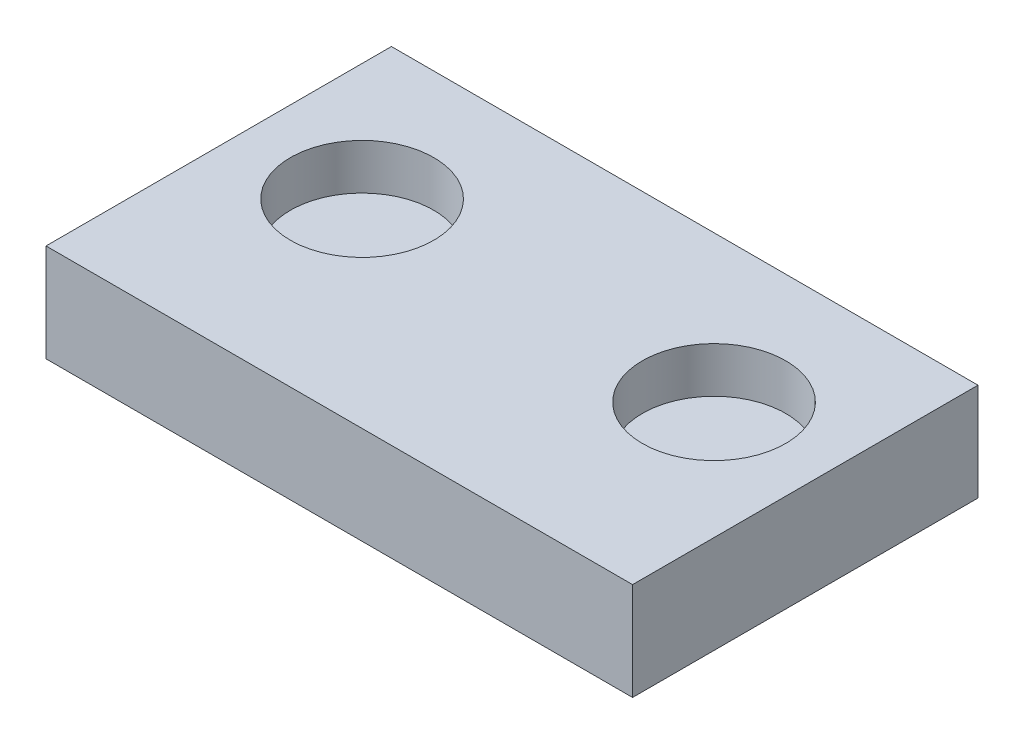
ISO-10303-21;
HEADER;
FILE_DESCRIPTION(('STEP AP214'),'2;1');
FILE_NAME('part.step','',(''),(''),'','','');
FILE_SCHEMA(('AUTOMOTIVE_DESIGN { 1 0 10303 214 1 1 1 1 }'));
ENDSEC;
DATA;
#1=APPLICATION_CONTEXT('core data for automotive mechanical design processes');
#2=APPLICATION_PROTOCOL_DEFINITION('international standard','automotive_design',2000,#1);
#3=PRODUCT_CONTEXT('',#1,'mechanical');
#4=PRODUCT('Part','Part','',(#3));
#5=PRODUCT_RELATED_PRODUCT_CATEGORY('part','',(#4));
#6=PRODUCT_DEFINITION_FORMATION('','',#4);
#7=PRODUCT_DEFINITION_CONTEXT('part definition',#1,'design');
#8=PRODUCT_DEFINITION('design','',#6,#7);
#9=PRODUCT_DEFINITION_SHAPE('','',#8);
#10=(LENGTH_UNIT() NAMED_UNIT(*) SI_UNIT(.MILLI.,.METRE.));
#11=(NAMED_UNIT(*) PLANE_ANGLE_UNIT() SI_UNIT($,.RADIAN.));
#12=(NAMED_UNIT(*) SI_UNIT($,.STERADIAN.) SOLID_ANGLE_UNIT());
#13=UNCERTAINTY_MEASURE_WITH_UNIT(LENGTH_MEASURE(1.E-05),#10,'distance_accuracy_value','');
#14=(GEOMETRIC_REPRESENTATION_CONTEXT(3) GLOBAL_UNCERTAINTY_ASSIGNED_CONTEXT((#13)) GLOBAL_UNIT_ASSIGNED_CONTEXT((#10,
#11,#12)) REPRESENTATION_CONTEXT('',''));
#15=CARTESIAN_POINT('',(0.,0.,0.));
#16=DIRECTION('',(0.,0.,1.));
#17=DIRECTION('',(1.,0.,0.));
#18=AXIS2_PLACEMENT_3D('',#15,#16,#17);
#19=CARTESIAN_POINT('',(0.,15.,0.));
#20=DIRECTION('',(0.,0.,-1.));
#21=DIRECTION('',(-1.,0.,0.));
#22=AXIS2_PLACEMENT_3D('',#19,#20,#21);
#23=PLANE('',#22);
#24=DIRECTION('',(1.,0.,0.));
#25=VECTOR('',#24,1.);
#26=CARTESIAN_POINT('',(0.,0.,0.));
#27=LINE('',#26,#25);
#28=CARTESIAN_POINT('',(0.,0.,0.));
#29=VERTEX_POINT('',#28);
#30=CARTESIAN_POINT('',(90.,0.,0.));
#31=VERTEX_POINT('',#30);
#32=EDGE_CURVE('E96',#29,#31,#27,.T.);
#33=ORIENTED_EDGE('',*,*,#32,.T.);
#34=DIRECTION('',(0.,-1.,0.));
#35=VECTOR('',#34,1.);
#36=CARTESIAN_POINT('',(90.,15.,0.));
#37=LINE('',#36,#35);
#38=CARTESIAN_POINT('',(90.,15.,0.));
#39=VERTEX_POINT('',#38);
#40=EDGE_CURVE('E11',#39,#31,#37,.T.);
#41=ORIENTED_EDGE('',*,*,#40,.F.);
#42=DIRECTION('',(1.,0.,0.));
#43=VECTOR('',#42,1.);
#44=CARTESIAN_POINT('',(0.,15.,0.));
#45=LINE('',#44,#43);
#46=CARTESIAN_POINT('',(0.,15.,0.));
#47=VERTEX_POINT('',#46);
#48=EDGE_CURVE('E82',#47,#39,#45,.T.);
#49=ORIENTED_EDGE('',*,*,#48,.F.);
#50=DIRECTION('',(0.,-1.,0.));
#51=VECTOR('',#50,1.);
#52=CARTESIAN_POINT('',(0.,15.,0.));
#53=LINE('',#52,#51);
#54=EDGE_CURVE('E49',#47,#29,#53,.T.);
#55=ORIENTED_EDGE('',*,*,#54,.T.);
#56=EDGE_LOOP('',(#33,#41,#49,#55));
#57=FACE_BOUND('',#56,.T.);
#58=ADVANCED_FACE('F33',(#57),#23,.F.);
#59=CARTESIAN_POINT('',(90.,15.,0.));
#60=DIRECTION('',(-1.,0.,0.));
#61=DIRECTION('',(0.,0.,1.));
#62=AXIS2_PLACEMENT_3D('',#59,#60,#61);
#63=PLANE('',#62);
#64=DIRECTION('',(0.,0.,-1.));
#65=VECTOR('',#64,1.);
#66=CARTESIAN_POINT('',(90.,0.,0.));
#67=LINE('',#66,#65);
#68=CARTESIAN_POINT('',(90.,0.,-53.));
#69=VERTEX_POINT('',#68);
#70=EDGE_CURVE('E87',#31,#69,#67,.T.);
#71=ORIENTED_EDGE('',*,*,#70,.T.);
#72=DIRECTION('',(0.,-1.,0.));
#73=VECTOR('',#72,1.);
#74=CARTESIAN_POINT('',(90.,15.,-53.));
#75=LINE('',#74,#73);
#76=CARTESIAN_POINT('',(90.,15.,-53.));
#77=VERTEX_POINT('',#76);
#78=EDGE_CURVE('E41',#77,#69,#75,.T.);
#79=ORIENTED_EDGE('',*,*,#78,.F.);
#80=DIRECTION('',(0.,0.,-1.));
#81=VECTOR('',#80,1.);
#82=CARTESIAN_POINT('',(90.,15.,0.));
#83=LINE('',#82,#81);
#84=EDGE_CURVE('E74',#39,#77,#83,.T.);
#85=ORIENTED_EDGE('',*,*,#84,.F.);
#86=ORIENTED_EDGE('',*,*,#40,.T.);
#87=EDGE_LOOP('',(#71,#79,#85,#86));
#88=FACE_BOUND('',#87,.T.);
#89=ADVANCED_FACE('F86',(#88),#63,.F.);
#90=CARTESIAN_POINT('',(0.,15.,-53.));
#91=DIRECTION('',(0.,0.,-1.));
#92=DIRECTION('',(-1.,0.,0.));
#93=AXIS2_PLACEMENT_3D('',#90,#91,#92);
#94=PLANE('',#93);
#95=DIRECTION('',(1.,0.,0.));
#96=VECTOR('',#95,1.);
#97=CARTESIAN_POINT('',(0.,0.,-53.));
#98=LINE('',#97,#96);
#99=CARTESIAN_POINT('',(0.,0.,-53.));
#100=VERTEX_POINT('',#99);
#101=EDGE_CURVE('E100',#100,#69,#98,.T.);
#102=ORIENTED_EDGE('',*,*,#101,.F.);
#103=DIRECTION('',(0.,-1.,0.));
#104=VECTOR('',#103,1.);
#105=CARTESIAN_POINT('',(0.,15.,-53.));
#106=LINE('',#105,#104);
#107=CARTESIAN_POINT('',(0.,15.,-53.));
#108=VERTEX_POINT('',#107);
#109=EDGE_CURVE('E63',#108,#100,#106,.T.);
#110=ORIENTED_EDGE('',*,*,#109,.F.);
#111=DIRECTION('',(1.,0.,0.));
#112=VECTOR('',#111,1.);
#113=CARTESIAN_POINT('',(0.,15.,-53.));
#114=LINE('',#113,#112);
#115=EDGE_CURVE('E81',#108,#77,#114,.T.);
#116=ORIENTED_EDGE('',*,*,#115,.T.);
#117=ORIENTED_EDGE('',*,*,#78,.T.);
#118=EDGE_LOOP('',(#102,#110,#116,#117));
#119=FACE_BOUND('',#118,.T.);
#120=ADVANCED_FACE('F90',(#119),#94,.T.);
#121=CARTESIAN_POINT('',(0.,15.,0.));
#122=DIRECTION('',(-1.,0.,0.));
#123=DIRECTION('',(0.,0.,1.));
#124=AXIS2_PLACEMENT_3D('',#121,#122,#123);
#125=PLANE('',#124);
#126=DIRECTION('',(0.,0.,-1.));
#127=VECTOR('',#126,1.);
#128=CARTESIAN_POINT('',(0.,0.,0.));
#129=LINE('',#128,#127);
#130=EDGE_CURVE('E102',#29,#100,#129,.T.);
#131=ORIENTED_EDGE('',*,*,#130,.F.);
#132=ORIENTED_EDGE('',*,*,#54,.F.);
#133=DIRECTION('',(0.,0.,-1.));
#134=VECTOR('',#133,1.);
#135=CARTESIAN_POINT('',(0.,15.,0.));
#136=LINE('',#135,#134);
#137=EDGE_CURVE('E91',#47,#108,#136,.T.);
#138=ORIENTED_EDGE('',*,*,#137,.T.);
#139=ORIENTED_EDGE('',*,*,#109,.T.);
#140=EDGE_LOOP('',(#131,#132,#138,#139));
#141=FACE_BOUND('',#140,.T.);
#142=ADVANCED_FACE('F132',(#141),#125,.T.);
#143=CARTESIAN_POINT('',(0.,15.,0.));
#144=DIRECTION('',(0.,1.,0.));
#145=DIRECTION('',(0.,0.,1.));
#146=AXIS2_PLACEMENT_3D('',#143,#144,#145);
#147=PLANE('',#146);
#148=CARTESIAN_POINT('',(72.,15.,-30.5));
#149=DIRECTION('',(0.,1.,0.));
#150=DIRECTION('',(0.,0.,1.));
#151=AXIS2_PLACEMENT_3D('',#148,#149,#150);
#152=CIRCLE('',#151,11.);
#153=CARTESIAN_POINT('',(72.,15.,-19.5));
#154=VERTEX_POINT('',#153);
#155=EDGE_CURVE('E114',#154,#154,#152,.T.);
#156=ORIENTED_EDGE('',*,*,#155,.F.);
#157=EDGE_LOOP('',(#156));
#158=FACE_BOUND('',#157,.T.);
#159=CARTESIAN_POINT('',(18.,15.,-30.5));
#160=DIRECTION('',(0.,1.,0.));
#161=DIRECTION('',(0.,0.,1.));
#162=AXIS2_PLACEMENT_3D('',#159,#160,#161);
#163=CIRCLE('',#162,11.);
#164=CARTESIAN_POINT('',(18.,15.,-19.5));
#165=VERTEX_POINT('',#164);
#166=EDGE_CURVE('E108',#165,#165,#163,.T.);
#167=ORIENTED_EDGE('',*,*,#166,.F.);
#168=EDGE_LOOP('',(#167));
#169=FACE_BOUND('',#168,.T.);
#170=ORIENTED_EDGE('',*,*,#48,.T.);
#171=ORIENTED_EDGE('',*,*,#84,.T.);
#172=ORIENTED_EDGE('',*,*,#115,.F.);
#173=ORIENTED_EDGE('',*,*,#137,.F.);
#174=EDGE_LOOP('',(#170,#171,#172,#173));
#175=FACE_BOUND('',#174,.T.);
#176=ADVANCED_FACE('F78',(#158,#169,#175),#147,.T.);
#177=CARTESIAN_POINT('',(0.,0.,0.));
#178=DIRECTION('',(0.,1.,0.));
#179=DIRECTION('',(0.,0.,1.));
#180=AXIS2_PLACEMENT_3D('',#177,#178,#179);
#181=PLANE('',#180);
#182=ORIENTED_EDGE('',*,*,#32,.F.);
#183=ORIENTED_EDGE('',*,*,#130,.T.);
#184=ORIENTED_EDGE('',*,*,#101,.T.);
#185=ORIENTED_EDGE('',*,*,#70,.F.);
#186=EDGE_LOOP('',(#182,#183,#184,#185));
#187=FACE_BOUND('',#186,.T.);
#188=ADVANCED_FACE('F131',(#187),#181,.F.);
#189=CARTESIAN_POINT('',(18.,8.,-30.5));
#190=DIRECTION('',(0.,1.,0.));
#191=DIRECTION('',(0.,0.,1.));
#192=AXIS2_PLACEMENT_3D('',#189,#190,#191);
#193=CYLINDRICAL_SURFACE('',#192,11.);
#194=CARTESIAN_POINT('',(18.,8.,-30.5));
#195=DIRECTION('',(0.,1.,0.));
#196=DIRECTION('',(0.,0.,1.));
#197=AXIS2_PLACEMENT_3D('',#194,#195,#196);
#198=CIRCLE('',#197,11.);
#199=CARTESIAN_POINT('',(18.,8.,-19.5));
#200=VERTEX_POINT('',#199);
#201=EDGE_CURVE('E98',#200,#200,#198,.T.);
#202=ORIENTED_EDGE('',*,*,#201,.F.);
#203=EDGE_LOOP('',(#202));
#204=FACE_BOUND('',#203,.T.);
#205=ORIENTED_EDGE('',*,*,#166,.T.);
#206=EDGE_LOOP('',(#205));
#207=FACE_BOUND('',#206,.T.);
#208=ADVANCED_FACE('F136',(#204,#207),#193,.F.);
#209=CARTESIAN_POINT('',(18.,8.,-30.5));
#210=DIRECTION('',(0.,1.,0.));
#211=DIRECTION('',(0.,0.,1.));
#212=AXIS2_PLACEMENT_3D('',#209,#210,#211);
#213=PLANE('',#212);
#214=ORIENTED_EDGE('',*,*,#201,.T.);
#215=EDGE_LOOP('',(#214));
#216=FACE_BOUND('',#215,.T.);
#217=ADVANCED_FACE('F125',(#216),#213,.T.);
#218=CARTESIAN_POINT('',(72.,8.,-30.5));
#219=DIRECTION('',(0.,1.,0.));
#220=DIRECTION('',(0.,0.,1.));
#221=AXIS2_PLACEMENT_3D('',#218,#219,#220);
#222=CYLINDRICAL_SURFACE('',#221,11.);
#223=CARTESIAN_POINT('',(72.,8.,-30.5));
#224=DIRECTION('',(0.,1.,0.));
#225=DIRECTION('',(0.,0.,1.));
#226=AXIS2_PLACEMENT_3D('',#223,#224,#225);
#227=CIRCLE('',#226,11.);
#228=CARTESIAN_POINT('',(72.,8.,-19.5));
#229=VERTEX_POINT('',#228);
#230=EDGE_CURVE('E111',#229,#229,#227,.T.);
#231=ORIENTED_EDGE('',*,*,#230,.F.);
#232=EDGE_LOOP('',(#231));
#233=FACE_BOUND('',#232,.T.);
#234=ORIENTED_EDGE('',*,*,#155,.T.);
#235=EDGE_LOOP('',(#234));
#236=FACE_BOUND('',#235,.T.);
#237=ADVANCED_FACE('F122',(#233,#236),#222,.F.);
#238=CARTESIAN_POINT('',(72.,8.,-30.5));
#239=DIRECTION('',(0.,1.,0.));
#240=DIRECTION('',(0.,0.,1.));
#241=AXIS2_PLACEMENT_3D('',#238,#239,#240);
#242=PLANE('',#241);
#243=ORIENTED_EDGE('',*,*,#230,.T.);
#244=EDGE_LOOP('',(#243));
#245=FACE_BOUND('',#244,.T.);
#246=ADVANCED_FACE('F120',(#245),#242,.T.);
#247=CLOSED_SHELL('',(#58,#89,#120,#142,#176,#188,#208,#217,#237,#246));
#248=MANIFOLD_SOLID_BREP('B2',#247);
#249=ADVANCED_BREP_SHAPE_REPRESENTATION('',(#18,#248),#14);
#250=SHAPE_DEFINITION_REPRESENTATION(#9,#249);
ENDSEC;
END-ISO-10303-21;
